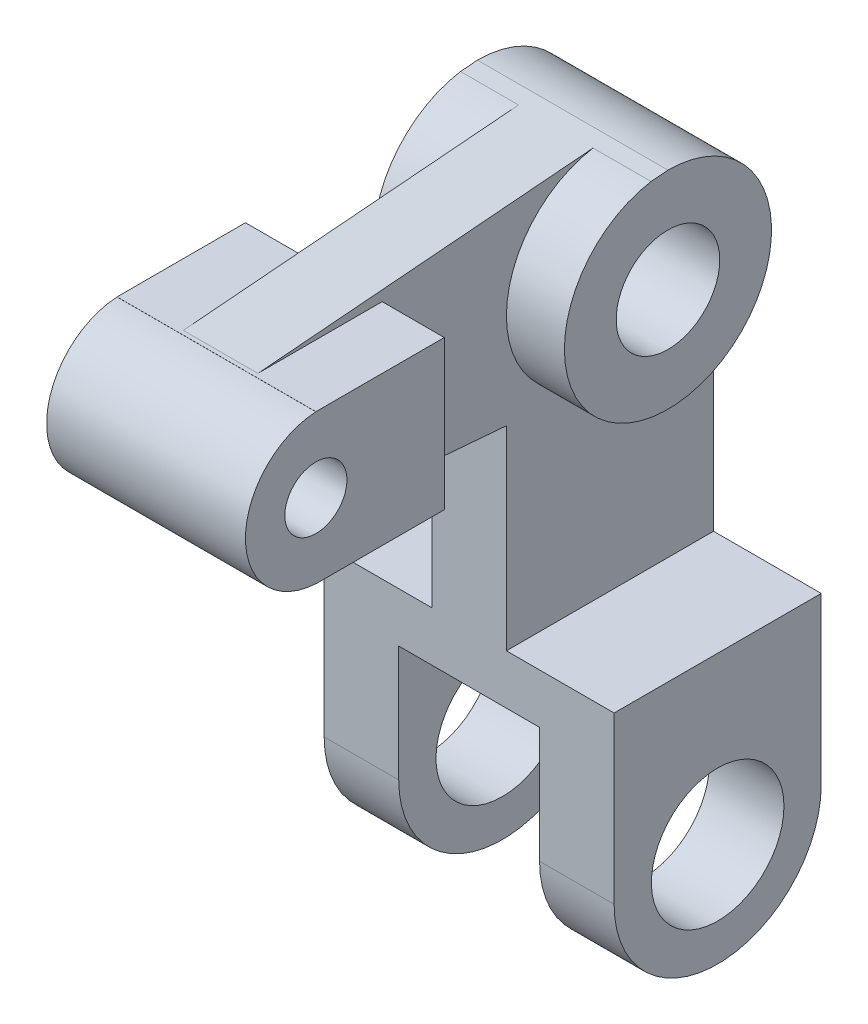
ISO-10303-21;
HEADER;
FILE_DESCRIPTION(('STEP AP214'),'2;1');
FILE_NAME('part.step','',(''),(''),'','','');
FILE_SCHEMA(('AUTOMOTIVE_DESIGN { 1 0 10303 214 1 1 1 1 }'));
ENDSEC;
DATA;
#1=APPLICATION_CONTEXT('core data for automotive mechanical design processes');
#2=APPLICATION_PROTOCOL_DEFINITION('international standard','automotive_design',2000,#1);
#3=PRODUCT_CONTEXT('',#1,'mechanical');
#4=PRODUCT('Part','Part','',(#3));
#5=PRODUCT_RELATED_PRODUCT_CATEGORY('part','',(#4));
#6=PRODUCT_DEFINITION_FORMATION('','',#4);
#7=PRODUCT_DEFINITION_CONTEXT('part definition',#1,'design');
#8=PRODUCT_DEFINITION('design','',#6,#7);
#9=PRODUCT_DEFINITION_SHAPE('','',#8);
#10=(LENGTH_UNIT() NAMED_UNIT(*) SI_UNIT(.MILLI.,.METRE.));
#11=(NAMED_UNIT(*) PLANE_ANGLE_UNIT() SI_UNIT($,.RADIAN.));
#12=(NAMED_UNIT(*) SI_UNIT($,.STERADIAN.) SOLID_ANGLE_UNIT());
#13=UNCERTAINTY_MEASURE_WITH_UNIT(LENGTH_MEASURE(1.E-05),#10,'distance_accuracy_value','');
#14=(GEOMETRIC_REPRESENTATION_CONTEXT(3) GLOBAL_UNCERTAINTY_ASSIGNED_CONTEXT((#13)) GLOBAL_UNIT_ASSIGNED_CONTEXT((#10,
#11,#12)) REPRESENTATION_CONTEXT('',''));
#15=CARTESIAN_POINT('',(0.,0.,0.));
#16=DIRECTION('',(0.,0.,1.));
#17=DIRECTION('',(1.,0.,0.));
#18=AXIS2_PLACEMENT_3D('',#15,#16,#17);
#19=CARTESIAN_POINT('',(9.,0.,0.));
#20=DIRECTION('',(1.,0.,0.));
#21=DIRECTION('',(0.,0.,-1.));
#22=AXIS2_PLACEMENT_3D('',#19,#20,#21);
#23=PLANE('',#22);
#24=DIRECTION('',(0.,-1.,0.));
#25=VECTOR('',#24,1.);
#26=CARTESIAN_POINT('',(9.,0.,55.));
#27=LINE('',#26,#25);
#28=CARTESIAN_POINT('',(9.,128.,55.));
#29=VERTEX_POINT('',#28);
#30=CARTESIAN_POINT('',(9.,92.,55.));
#31=VERTEX_POINT('',#30);
#32=EDGE_CURVE('E65',#29,#31,#27,.T.);
#33=ORIENTED_EDGE('',*,*,#32,.T.);
#34=DIRECTION('',(0.,0.,1.));
#35=VECTOR('',#34,1.);
#36=CARTESIAN_POINT('',(9.,92.,0.));
#37=LINE('',#36,#35);
#38=CARTESIAN_POINT('',(9.,92.,84.9999999999999));
#39=VERTEX_POINT('',#38);
#40=EDGE_CURVE('E274',#31,#39,#37,.T.);
#41=ORIENTED_EDGE('',*,*,#40,.T.);
#42=DIRECTION('',(0.,-0.0820750945403038,-0.996626147989405));
#43=VECTOR('',#42,1.);
#44=CARTESIAN_POINT('',(9.,84.427412702777,-6.95284575199339));
#45=LINE('',#44,#43);
#46=CARTESIAN_POINT('',(9.,87.0588235294118,25.));
#47=VERTEX_POINT('',#46);
#48=EDGE_CURVE('E405',#39,#47,#45,.T.);
#49=ORIENTED_EDGE('',*,*,#48,.T.);
#50=DIRECTION('',(0.,1.,0.));
#51=VECTOR('',#50,1.);
#52=CARTESIAN_POINT('',(9.,0.,25.));
#53=LINE('',#52,#51);
#54=CARTESIAN_POINT('',(9.,40.,25.));
#55=VERTEX_POINT('',#54);
#56=EDGE_CURVE('E408',#55,#47,#53,.T.);
#57=ORIENTED_EDGE('',*,*,#56,.F.);
#58=DIRECTION('',(0.,0.,-1.));
#59=VECTOR('',#58,1.);
#60=CARTESIAN_POINT('',(9.,40.,0.));
#61=LINE('',#60,#59);
#62=CARTESIAN_POINT('',(9.,40.,-25.));
#63=VERTEX_POINT('',#62);
#64=EDGE_CURVE('E413',#55,#63,#61,.T.);
#65=ORIENTED_EDGE('',*,*,#64,.T.);
#66=DIRECTION('',(0.,-1.,0.));
#67=VECTOR('',#66,1.);
#68=CARTESIAN_POINT('',(9.,0.,-25.));
#69=LINE('',#68,#67);
#70=CARTESIAN_POINT('',(9.,110.,-25.));
#71=VERTEX_POINT('',#70);
#72=EDGE_CURVE('E417',#71,#63,#69,.T.);
#73=ORIENTED_EDGE('',*,*,#72,.F.);
#74=CARTESIAN_POINT('',(9.,110.,0.));
#75=DIRECTION('',(1.,0.,0.));
#76=DIRECTION('',(0.,0.,-1.));
#77=AXIS2_PLACEMENT_3D('',#74,#75,#76);
#78=CIRCLE('',#77,25.);
#79=CARTESIAN_POINT('',(9.,134.66318394281,4.08990926587834));
#80=VERTEX_POINT('',#79);
#81=EDGE_CURVE('E421',#80,#71,#78,.T.);
#82=ORIENTED_EDGE('',*,*,#81,.F.);
#83=DIRECTION('',(0.,0.082075094540304,-0.996626147989405));
#84=VECTOR('',#83,1.);
#85=CARTESIAN_POINT('',(9.,134.090596645587,11.0427550178719));
#86=LINE('',#85,#84);
#87=CARTESIAN_POINT('',(9.,128.,84.9999999999999));
#88=VERTEX_POINT('',#87);
#89=EDGE_CURVE('E424',#88,#80,#86,.T.);
#90=ORIENTED_EDGE('',*,*,#89,.F.);
#91=DIRECTION('',(0.,0.,-1.));
#92=VECTOR('',#91,1.);
#93=CARTESIAN_POINT('',(9.,128.,0.));
#94=LINE('',#93,#92);
#95=EDGE_CURVE('E271',#88,#29,#94,.T.);
#96=ORIENTED_EDGE('',*,*,#95,.T.);
#97=EDGE_LOOP('',(#33,#41,#49,#57,#65,#73,#82,#90,#96));
#98=FACE_BOUND('',#97,.T.);
#99=ADVANCED_FACE('F40',(#98),#23,.T.);
#100=CARTESIAN_POINT('',(-9.,0.,0.));
#101=DIRECTION('',(1.,0.,0.));
#102=DIRECTION('',(0.,0.,-1.));
#103=AXIS2_PLACEMENT_3D('',#100,#101,#102);
#104=PLANE('',#103);
#105=DIRECTION('',(0.,0.,1.));
#106=VECTOR('',#105,1.);
#107=CARTESIAN_POINT('',(-9.,92.,0.));
#108=LINE('',#107,#106);
#109=CARTESIAN_POINT('',(-9.,92.,55.));
#110=VERTEX_POINT('',#109);
#111=CARTESIAN_POINT('',(-9.,92.,85.));
#112=VERTEX_POINT('',#111);
#113=EDGE_CURVE('E11',#110,#112,#108,.T.);
#114=ORIENTED_EDGE('',*,*,#113,.F.);
#115=DIRECTION('',(0.,-1.,0.));
#116=VECTOR('',#115,1.);
#117=CARTESIAN_POINT('',(-9.,0.,55.));
#118=LINE('',#117,#116);
#119=CARTESIAN_POINT('',(-9.,128.,55.));
#120=VERTEX_POINT('',#119);
#121=EDGE_CURVE('E478',#120,#110,#118,.T.);
#122=ORIENTED_EDGE('',*,*,#121,.F.);
#123=DIRECTION('',(0.,0.,-1.));
#124=VECTOR('',#123,1.);
#125=CARTESIAN_POINT('',(-9.,128.,0.));
#126=LINE('',#125,#124);
#127=CARTESIAN_POINT('',(-9.,128.,85.));
#128=VERTEX_POINT('',#127);
#129=EDGE_CURVE('E50',#128,#120,#126,.T.);
#130=ORIENTED_EDGE('',*,*,#129,.F.);
#131=DIRECTION('',(0.,0.082075094540304,-0.996626147989405));
#132=VECTOR('',#131,1.);
#133=CARTESIAN_POINT('',(-9.,134.090596645587,11.0427550178719));
#134=LINE('',#133,#132);
#135=CARTESIAN_POINT('',(-9.,134.66318394281,4.08990926587834));
#136=VERTEX_POINT('',#135);
#137=EDGE_CURVE('E409',#128,#136,#134,.T.);
#138=ORIENTED_EDGE('',*,*,#137,.T.);
#139=CARTESIAN_POINT('',(-9.,110.,0.));
#140=DIRECTION('',(1.,0.,0.));
#141=DIRECTION('',(0.,0.,-1.));
#142=AXIS2_PLACEMENT_3D('',#139,#140,#141);
#143=CIRCLE('',#142,25.);
#144=CARTESIAN_POINT('',(-9.,110.,-25.));
#145=VERTEX_POINT('',#144);
#146=EDGE_CURVE('E443',#136,#145,#143,.T.);
#147=ORIENTED_EDGE('',*,*,#146,.T.);
#148=DIRECTION('',(0.,-1.,0.));
#149=VECTOR('',#148,1.);
#150=CARTESIAN_POINT('',(-9.,0.,-25.));
#151=LINE('',#150,#149);
#152=CARTESIAN_POINT('',(-9.,40.,-25.));
#153=VERTEX_POINT('',#152);
#154=EDGE_CURVE('E439',#145,#153,#151,.T.);
#155=ORIENTED_EDGE('',*,*,#154,.T.);
#156=DIRECTION('',(0.,0.,-1.));
#157=VECTOR('',#156,1.);
#158=CARTESIAN_POINT('',(-9.,40.,0.));
#159=LINE('',#158,#157);
#160=CARTESIAN_POINT('',(-9.,40.,25.));
#161=VERTEX_POINT('',#160);
#162=EDGE_CURVE('E436',#161,#153,#159,.T.);
#163=ORIENTED_EDGE('',*,*,#162,.F.);
#164=DIRECTION('',(0.,1.,0.));
#165=VECTOR('',#164,1.);
#166=CARTESIAN_POINT('',(-9.,0.,25.));
#167=LINE('',#166,#165);
#168=CARTESIAN_POINT('',(-9.,87.0588235294118,25.));
#169=VERTEX_POINT('',#168);
#170=EDGE_CURVE('E432',#161,#169,#167,.T.);
#171=ORIENTED_EDGE('',*,*,#170,.T.);
#172=DIRECTION('',(0.,-0.0820750945403038,-0.996626147989405));
#173=VECTOR('',#172,1.);
#174=CARTESIAN_POINT('',(-9.,84.427412702777,-6.95284575199339));
#175=LINE('',#174,#173);
#176=EDGE_CURVE('E404',#112,#169,#175,.T.);
#177=ORIENTED_EDGE('',*,*,#176,.F.);
#178=EDGE_LOOP('',(#114,#122,#130,#138,#147,#155,#163,#171,#177));
#179=FACE_BOUND('',#178,.T.);
#180=ADVANCED_FACE('F530',(#179),#104,.F.);
#181=CARTESIAN_POINT('',(35.,0.,0.));
#182=DIRECTION('',(-1.,0.,0.));
#183=DIRECTION('',(0.,0.,1.));
#184=AXIS2_PLACEMENT_3D('',#181,#182,#183);
#185=CYLINDRICAL_SURFACE('',#184,25.);
#186=DIRECTION('',(-1.,0.,0.));
#187=VECTOR('',#186,1.);
#188=CARTESIAN_POINT('',(35.,0.,-25.));
#189=LINE('',#188,#187);
#190=CARTESIAN_POINT('',(-17.,0.,-25.));
#191=VERTEX_POINT('',#190);
#192=CARTESIAN_POINT('',(-35.,0.,-25.));
#193=VERTEX_POINT('',#192);
#194=EDGE_CURVE('E364',#191,#193,#189,.T.);
#195=ORIENTED_EDGE('',*,*,#194,.F.);
#196=CARTESIAN_POINT('',(-17.,0.,0.));
#197=DIRECTION('',(-1.,0.,0.));
#198=DIRECTION('',(0.,-1.,0.));
#199=AXIS2_PLACEMENT_3D('',#196,#197,#198);
#200=CIRCLE('',#199,25.);
#201=CARTESIAN_POINT('',(-17.,0.,25.));
#202=VERTEX_POINT('',#201);
#203=EDGE_CURVE('E303',#191,#202,#200,.T.);
#204=ORIENTED_EDGE('',*,*,#203,.T.);
#205=DIRECTION('',(-1.,0.,0.));
#206=VECTOR('',#205,1.);
#207=CARTESIAN_POINT('',(35.,0.,25.));
#208=LINE('',#207,#206);
#209=CARTESIAN_POINT('',(-35.,0.,25.));
#210=VERTEX_POINT('',#209);
#211=EDGE_CURVE('E369',#202,#210,#208,.T.);
#212=ORIENTED_EDGE('',*,*,#211,.T.);
#213=CARTESIAN_POINT('',(-35.,0.,0.));
#214=DIRECTION('',(1.,0.,0.));
#215=DIRECTION('',(0.,0.,-1.));
#216=AXIS2_PLACEMENT_3D('',#213,#214,#215);
#217=CIRCLE('',#216,25.);
#218=EDGE_CURVE('E345',#210,#193,#217,.T.);
#219=ORIENTED_EDGE('',*,*,#218,.T.);
#220=EDGE_LOOP('',(#195,#204,#212,#219));
#221=FACE_BOUND('',#220,.T.);
#222=ADVANCED_FACE('F536',(#221),#185,.T.);
#223=CARTESIAN_POINT('',(35.,0.,0.));
#224=DIRECTION('',(-1.,0.,0.));
#225=DIRECTION('',(0.,0.,1.));
#226=AXIS2_PLACEMENT_3D('',#223,#224,#225);
#227=CYLINDRICAL_SURFACE('',#226,16.);
#228=CARTESIAN_POINT('',(-17.,0.,0.));
#229=DIRECTION('',(-1.,0.,0.));
#230=DIRECTION('',(0.,-1.,0.));
#231=AXIS2_PLACEMENT_3D('',#228,#229,#230);
#232=CIRCLE('',#231,16.);
#233=CARTESIAN_POINT('',(-17.,-16.,0.));
#234=VERTEX_POINT('',#233);
#235=EDGE_CURVE('E302',#234,#234,#232,.T.);
#236=ORIENTED_EDGE('',*,*,#235,.F.);
#237=EDGE_LOOP('',(#236));
#238=FACE_BOUND('',#237,.T.);
#239=CARTESIAN_POINT('',(-35.,0.,0.));
#240=DIRECTION('',(1.,0.,0.));
#241=DIRECTION('',(0.,0.,-1.));
#242=AXIS2_PLACEMENT_3D('',#239,#240,#241);
#243=CIRCLE('',#242,16.);
#244=CARTESIAN_POINT('',(-35.,0.,-16.));
#245=VERTEX_POINT('',#244);
#246=EDGE_CURVE('E316',#245,#245,#243,.T.);
#247=ORIENTED_EDGE('',*,*,#246,.F.);
#248=EDGE_LOOP('',(#247));
#249=FACE_BOUND('',#248,.T.);
#250=ADVANCED_FACE('F557',(#238,#249),#227,.F.);
#251=CARTESIAN_POINT('',(9.,84.427412702777,-6.95284575199339));
#252=DIRECTION('',(0.,0.996626147989405,-0.0820750945403038));
#253=DIRECTION('',(0.,0.0820750945403038,0.996626147989405));
#254=AXIS2_PLACEMENT_3D('',#251,#252,#253);
#255=PLANE('',#254);
#256=ORIENTED_EDGE('',*,*,#176,.T.);
#257=DIRECTION('',(-1.,0.,0.));
#258=VECTOR('',#257,1.);
#259=CARTESIAN_POINT('',(9.,87.0588235294118,25.));
#260=LINE('',#259,#258);
#261=EDGE_CURVE('E456',#47,#169,#260,.T.);
#262=ORIENTED_EDGE('',*,*,#261,.F.);
#263=ORIENTED_EDGE('',*,*,#48,.F.);
#264=DIRECTION('',(-1.,0.,0.));
#265=VECTOR('',#264,1.);
#266=CARTESIAN_POINT('',(9.,92.,85.));
#267=LINE('',#266,#265);
#268=EDGE_CURVE('E459',#39,#112,#267,.T.);
#269=ORIENTED_EDGE('',*,*,#268,.T.);
#270=EDGE_LOOP('',(#256,#262,#263,#269));
#271=FACE_BOUND('',#270,.T.);
#272=ADVANCED_FACE('F554',(#271),#255,.F.);
#273=CARTESIAN_POINT('',(9.,0.,25.));
#274=DIRECTION('',(0.,0.,1.));
#275=DIRECTION('',(1.,0.,0.));
#276=AXIS2_PLACEMENT_3D('',#273,#274,#275);
#277=PLANE('',#276);
#278=DIRECTION('',(0.,-1.,0.));
#279=VECTOR('',#278,1.);
#280=CARTESIAN_POINT('',(-17.,0.,25.));
#281=LINE('',#280,#279);
#282=CARTESIAN_POINT('',(-17.,28.,25.));
#283=VERTEX_POINT('',#282);
#284=EDGE_CURVE('E310',#283,#202,#281,.T.);
#285=ORIENTED_EDGE('',*,*,#284,.F.);
#286=DIRECTION('',(-1.,0.,0.));
#287=VECTOR('',#286,1.);
#288=CARTESIAN_POINT('',(9.,28.,25.));
#289=LINE('',#288,#287);
#290=CARTESIAN_POINT('',(17.,28.,25.));
#291=VERTEX_POINT('',#290);
#292=EDGE_CURVE('E313',#291,#283,#289,.T.);
#293=ORIENTED_EDGE('',*,*,#292,.F.);
#294=DIRECTION('',(0.,1.,0.));
#295=VECTOR('',#294,1.);
#296=CARTESIAN_POINT('',(17.,0.,25.));
#297=LINE('',#296,#295);
#298=CARTESIAN_POINT('',(17.,0.,25.));
#299=VERTEX_POINT('',#298);
#300=EDGE_CURVE('E299',#299,#291,#297,.T.);
#301=ORIENTED_EDGE('',*,*,#300,.F.);
#302=CARTESIAN_POINT('',(35.,0.,25.));
#303=VERTEX_POINT('',#302);
#304=EDGE_CURVE('E370',#303,#299,#208,.T.);
#305=ORIENTED_EDGE('',*,*,#304,.F.);
#306=DIRECTION('',(0.,1.,0.));
#307=VECTOR('',#306,1.);
#308=CARTESIAN_POINT('',(35.,0.,25.));
#309=LINE('',#308,#307);
#310=CARTESIAN_POINT('',(35.,40.,25.));
#311=VERTEX_POINT('',#310);
#312=EDGE_CURVE('E321',#303,#311,#309,.T.);
#313=ORIENTED_EDGE('',*,*,#312,.T.);
#314=DIRECTION('',(-1.,0.,0.));
#315=VECTOR('',#314,1.);
#316=CARTESIAN_POINT('',(35.,40.,25.));
#317=LINE('',#316,#315);
#318=EDGE_CURVE('E356',#311,#55,#317,.T.);
#319=ORIENTED_EDGE('',*,*,#318,.T.);
#320=ORIENTED_EDGE('',*,*,#56,.T.);
#321=ORIENTED_EDGE('',*,*,#261,.T.);
#322=ORIENTED_EDGE('',*,*,#170,.F.);
#323=CARTESIAN_POINT('',(-35.,40.,25.));
#324=VERTEX_POINT('',#323);
#325=EDGE_CURVE('E337',#161,#324,#317,.T.);
#326=ORIENTED_EDGE('',*,*,#325,.T.);
#327=DIRECTION('',(0.,1.,0.));
#328=VECTOR('',#327,1.);
#329=CARTESIAN_POINT('',(-35.,0.,25.));
#330=LINE('',#329,#328);
#331=EDGE_CURVE('E341',#210,#324,#330,.T.);
#332=ORIENTED_EDGE('',*,*,#331,.F.);
#333=ORIENTED_EDGE('',*,*,#211,.F.);
#334=EDGE_LOOP('',(#285,#293,#301,#305,#313,#319,#320,#321,#322,#326,#332,#333));
#335=FACE_BOUND('',#334,.T.);
#336=ADVANCED_FACE('F550',(#335),#277,.T.);
#337=CARTESIAN_POINT('',(9.,0.,-25.));
#338=DIRECTION('',(0.,0.,-1.));
#339=DIRECTION('',(0.,1.,0.));
#340=AXIS2_PLACEMENT_3D('',#337,#338,#339);
#341=PLANE('',#340);
#342=DIRECTION('',(0.,1.,0.));
#343=VECTOR('',#342,1.);
#344=CARTESIAN_POINT('',(-17.,0.,-25.));
#345=LINE('',#344,#343);
#346=CARTESIAN_POINT('',(-17.,28.,-25.));
#347=VERTEX_POINT('',#346);
#348=EDGE_CURVE('E307',#191,#347,#345,.T.);
#349=ORIENTED_EDGE('',*,*,#348,.F.);
#350=ORIENTED_EDGE('',*,*,#194,.T.);
#351=DIRECTION('',(0.,-1.,0.));
#352=VECTOR('',#351,1.);
#353=CARTESIAN_POINT('',(-35.,0.,-25.));
#354=LINE('',#353,#352);
#355=CARTESIAN_POINT('',(-35.,40.,-25.));
#356=VERTEX_POINT('',#355);
#357=EDGE_CURVE('E349',#356,#193,#354,.T.);
#358=ORIENTED_EDGE('',*,*,#357,.F.);
#359=DIRECTION('',(-1.,0.,0.));
#360=VECTOR('',#359,1.);
#361=CARTESIAN_POINT('',(35.,40.,-25.));
#362=LINE('',#361,#360);
#363=EDGE_CURVE('E360',#153,#356,#362,.T.);
#364=ORIENTED_EDGE('',*,*,#363,.F.);
#365=ORIENTED_EDGE('',*,*,#154,.F.);
#366=DIRECTION('',(-1.,0.,0.));
#367=VECTOR('',#366,1.);
#368=CARTESIAN_POINT('',(9.,110.,-25.));
#369=LINE('',#368,#367);
#370=EDGE_CURVE('E453',#71,#145,#369,.T.);
#371=ORIENTED_EDGE('',*,*,#370,.F.);
#372=ORIENTED_EDGE('',*,*,#72,.T.);
#373=CARTESIAN_POINT('',(35.,40.,-25.));
#374=VERTEX_POINT('',#373);
#375=EDGE_CURVE('E361',#374,#63,#362,.T.);
#376=ORIENTED_EDGE('',*,*,#375,.F.);
#377=DIRECTION('',(0.,-1.,0.));
#378=VECTOR('',#377,1.);
#379=CARTESIAN_POINT('',(35.,0.,-25.));
#380=LINE('',#379,#378);
#381=CARTESIAN_POINT('',(35.,0.,-25.));
#382=VERTEX_POINT('',#381);
#383=EDGE_CURVE('E329',#374,#382,#380,.T.);
#384=ORIENTED_EDGE('',*,*,#383,.T.);
#385=CARTESIAN_POINT('',(17.,0.,-25.));
#386=VERTEX_POINT('',#385);
#387=EDGE_CURVE('E365',#382,#386,#189,.T.);
#388=ORIENTED_EDGE('',*,*,#387,.T.);
#389=DIRECTION('',(0.,-1.,0.));
#390=VECTOR('',#389,1.);
#391=CARTESIAN_POINT('',(17.,0.,-25.));
#392=LINE('',#391,#390);
#393=CARTESIAN_POINT('',(17.,28.,-25.));
#394=VERTEX_POINT('',#393);
#395=EDGE_CURVE('E296',#394,#386,#392,.T.);
#396=ORIENTED_EDGE('',*,*,#395,.F.);
#397=DIRECTION('',(1.,0.,0.));
#398=VECTOR('',#397,1.);
#399=CARTESIAN_POINT('',(9.,28.,-25.));
#400=LINE('',#399,#398);
#401=EDGE_CURVE('E467',#347,#394,#400,.T.);
#402=ORIENTED_EDGE('',*,*,#401,.F.);
#403=EDGE_LOOP('',(#349,#350,#358,#364,#365,#371,#372,#376,#384,#388,#396,#402));
#404=FACE_BOUND('',#403,.T.);
#405=ADVANCED_FACE('F546',(#404),#341,.T.);
#406=CARTESIAN_POINT('',(9.,134.090596645587,11.0427550178719));
#407=DIRECTION('',(0.,0.996626147989405,0.082075094540304));
#408=DIRECTION('',(0.,-0.082075094540304,0.996626147989405));
#409=AXIS2_PLACEMENT_3D('',#406,#407,#408);
#410=PLANE('',#409);
#411=ORIENTED_EDGE('',*,*,#137,.F.);
#412=DIRECTION('',(-1.,0.,0.));
#413=VECTOR('',#412,1.);
#414=CARTESIAN_POINT('',(9.,128.,85.));
#415=LINE('',#414,#413);
#416=EDGE_CURVE('E428',#88,#128,#415,.T.);
#417=ORIENTED_EDGE('',*,*,#416,.F.);
#418=ORIENTED_EDGE('',*,*,#89,.T.);
#419=DIRECTION('',(-1.,0.,0.));
#420=VECTOR('',#419,1.);
#421=CARTESIAN_POINT('',(23.,134.66318394281,4.08990926587834));
#422=LINE('',#421,#420);
#423=CARTESIAN_POINT('',(23.,134.66318394281,4.08990926587834));
#424=VERTEX_POINT('',#423);
#425=EDGE_CURVE('E398',#424,#80,#422,.T.);
#426=ORIENTED_EDGE('',*,*,#425,.F.);
#427=DIRECTION('',(0.,0.082075094540304,-0.996626147989405));
#428=VECTOR('',#427,1.);
#429=CARTESIAN_POINT('',(23.,134.090596645587,11.0427550178719));
#430=LINE('',#429,#428);
#431=CARTESIAN_POINT('',(23.,135.,0.));
#432=VERTEX_POINT('',#431);
#433=EDGE_CURVE('E383',#424,#432,#430,.T.);
#434=ORIENTED_EDGE('',*,*,#433,.T.);
#435=DIRECTION('',(-1.,0.,0.));
#436=VECTOR('',#435,1.);
#437=CARTESIAN_POINT('',(23.,135.,0.));
#438=LINE('',#437,#436);
#439=CARTESIAN_POINT('',(-23.,135.,0.));
#440=VERTEX_POINT('',#439);
#441=EDGE_CURVE('E401',#432,#440,#438,.T.);
#442=ORIENTED_EDGE('',*,*,#441,.T.);
#443=DIRECTION('',(0.,0.082075094540304,-0.996626147989405));
#444=VECTOR('',#443,1.);
#445=CARTESIAN_POINT('',(-23.,134.090596645587,11.0427550178719));
#446=LINE('',#445,#444);
#447=CARTESIAN_POINT('',(-23.,134.66318394281,4.08990926587834));
#448=VERTEX_POINT('',#447);
#449=EDGE_CURVE('E380',#448,#440,#446,.T.);
#450=ORIENTED_EDGE('',*,*,#449,.F.);
#451=EDGE_CURVE('E387',#136,#448,#422,.T.);
#452=ORIENTED_EDGE('',*,*,#451,.F.);
#453=EDGE_LOOP('',(#411,#417,#418,#426,#434,#442,#450,#452));
#454=FACE_BOUND('',#453,.T.);
#455=ADVANCED_FACE('F542',(#454),#410,.T.);
#456=CARTESIAN_POINT('',(23.,110.,0.));
#457=DIRECTION('',(-1.,0.,0.));
#458=DIRECTION('',(0.,0.,1.));
#459=AXIS2_PLACEMENT_3D('',#456,#457,#458);
#460=CYLINDRICAL_SURFACE('',#459,25.);
#461=ORIENTED_EDGE('',*,*,#81,.T.);
#462=ORIENTED_EDGE('',*,*,#370,.T.);
#463=ORIENTED_EDGE('',*,*,#146,.F.);
#464=ORIENTED_EDGE('',*,*,#451,.T.);
#465=CARTESIAN_POINT('',(-23.,110.,0.));
#466=DIRECTION('',(1.,0.,0.));
#467=DIRECTION('',(0.,0.,-1.));
#468=AXIS2_PLACEMENT_3D('',#465,#466,#467);
#469=CIRCLE('',#468,25.);
#470=EDGE_CURVE('E391',#448,#440,#469,.T.);
#471=ORIENTED_EDGE('',*,*,#470,.T.);
#472=ORIENTED_EDGE('',*,*,#441,.F.);
#473=CARTESIAN_POINT('',(23.,110.,0.));
#474=DIRECTION('',(1.,0.,0.));
#475=DIRECTION('',(0.,0.,-1.));
#476=AXIS2_PLACEMENT_3D('',#473,#474,#475);
#477=CIRCLE('',#476,25.);
#478=EDGE_CURVE('E379',#424,#432,#477,.T.);
#479=ORIENTED_EDGE('',*,*,#478,.F.);
#480=ORIENTED_EDGE('',*,*,#425,.T.);
#481=EDGE_LOOP('',(#461,#462,#463,#464,#471,#472,#479,#480));
#482=FACE_BOUND('',#481,.T.);
#483=ADVANCED_FACE('F545',(#482),#460,.T.);
#484=CARTESIAN_POINT('',(23.,110.,0.));
#485=DIRECTION('',(-1.,0.,0.));
#486=DIRECTION('',(0.,0.,1.));
#487=AXIS2_PLACEMENT_3D('',#484,#485,#486);
#488=CYLINDRICAL_SURFACE('',#487,12.5);
#489=CARTESIAN_POINT('',(23.,110.,0.));
#490=DIRECTION('',(1.,0.,0.));
#491=DIRECTION('',(0.,0.,-1.));
#492=AXIS2_PLACEMENT_3D('',#489,#490,#491);
#493=CIRCLE('',#492,12.5);
#494=CARTESIAN_POINT('',(23.,110.,-12.5));
#495=VERTEX_POINT('',#494);
#496=EDGE_CURVE('E375',#495,#495,#493,.T.);
#497=ORIENTED_EDGE('',*,*,#496,.T.);
#498=EDGE_LOOP('',(#497));
#499=FACE_BOUND('',#498,.T.);
#500=CARTESIAN_POINT('',(-23.,110.,0.));
#501=DIRECTION('',(1.,0.,0.));
#502=DIRECTION('',(0.,0.,-1.));
#503=AXIS2_PLACEMENT_3D('',#500,#501,#502);
#504=CIRCLE('',#503,12.5);
#505=CARTESIAN_POINT('',(-23.,110.,-12.5));
#506=VERTEX_POINT('',#505);
#507=EDGE_CURVE('E374',#506,#506,#504,.T.);
#508=ORIENTED_EDGE('',*,*,#507,.F.);
#509=EDGE_LOOP('',(#508));
#510=FACE_BOUND('',#509,.T.);
#511=ADVANCED_FACE('F539',(#499,#510),#488,.F.);
#512=CARTESIAN_POINT('',(23.,0.,0.));
#513=DIRECTION('',(1.,0.,0.));
#514=DIRECTION('',(0.,0.,-1.));
#515=AXIS2_PLACEMENT_3D('',#512,#513,#514);
#516=PLANE('',#515);
#517=ORIENTED_EDGE('',*,*,#496,.F.);
#518=EDGE_LOOP('',(#517));
#519=FACE_BOUND('',#518,.T.);
#520=ORIENTED_EDGE('',*,*,#478,.T.);
#521=ORIENTED_EDGE('',*,*,#433,.F.);
#522=EDGE_LOOP('',(#520,#521));
#523=FACE_BOUND('',#522,.T.);
#524=ADVANCED_FACE('F607',(#519,#523),#516,.T.);
#525=CARTESIAN_POINT('',(-23.,0.,0.));
#526=DIRECTION('',(1.,0.,0.));
#527=DIRECTION('',(0.,0.,-1.));
#528=AXIS2_PLACEMENT_3D('',#525,#526,#527);
#529=PLANE('',#528);
#530=ORIENTED_EDGE('',*,*,#507,.T.);
#531=EDGE_LOOP('',(#530));
#532=FACE_BOUND('',#531,.T.);
#533=ORIENTED_EDGE('',*,*,#470,.F.);
#534=ORIENTED_EDGE('',*,*,#449,.T.);
#535=EDGE_LOOP('',(#533,#534));
#536=FACE_BOUND('',#535,.T.);
#537=ADVANCED_FACE('F610',(#532,#536),#529,.F.);
#538=CARTESIAN_POINT('',(35.,40.,0.));
#539=DIRECTION('',(0.,1.,0.));
#540=DIRECTION('',(0.,0.,1.));
#541=AXIS2_PLACEMENT_3D('',#538,#539,#540);
#542=PLANE('',#541);
#543=ORIENTED_EDGE('',*,*,#64,.F.);
#544=ORIENTED_EDGE('',*,*,#318,.F.);
#545=DIRECTION('',(0.,0.,-1.));
#546=VECTOR('',#545,1.);
#547=CARTESIAN_POINT('',(35.,40.,0.));
#548=LINE('',#547,#546);
#549=EDGE_CURVE('E333',#311,#374,#548,.T.);
#550=ORIENTED_EDGE('',*,*,#549,.T.);
#551=ORIENTED_EDGE('',*,*,#375,.T.);
#552=EDGE_LOOP('',(#543,#544,#550,#551));
#553=FACE_BOUND('',#552,.T.);
#554=ADVANCED_FACE('F599',(#553),#542,.T.);
#555=ORIENTED_EDGE('',*,*,#304,.T.);
#556=CARTESIAN_POINT('',(17.,0.,0.));
#557=DIRECTION('',(1.,0.,0.));
#558=DIRECTION('',(0.,1.,0.));
#559=AXIS2_PLACEMENT_3D('',#556,#557,#558);
#560=CIRCLE('',#559,25.);
#561=EDGE_CURVE('E292',#299,#386,#560,.T.);
#562=ORIENTED_EDGE('',*,*,#561,.T.);
#563=ORIENTED_EDGE('',*,*,#387,.F.);
#564=CARTESIAN_POINT('',(35.,0.,0.));
#565=DIRECTION('',(1.,0.,0.));
#566=DIRECTION('',(0.,0.,-1.));
#567=AXIS2_PLACEMENT_3D('',#564,#565,#566);
#568=CIRCLE('',#567,25.);
#569=EDGE_CURVE('E326',#303,#382,#568,.T.);
#570=ORIENTED_EDGE('',*,*,#569,.F.);
#571=EDGE_LOOP('',(#555,#562,#563,#570));
#572=FACE_BOUND('',#571,.T.);
#573=ADVANCED_FACE('F600',(#572),#185,.T.);
#574=CARTESIAN_POINT('',(17.,0.,0.));
#575=DIRECTION('',(1.,0.,0.));
#576=DIRECTION('',(0.,1.,0.));
#577=AXIS2_PLACEMENT_3D('',#574,#575,#576);
#578=CIRCLE('',#577,16.);
#579=CARTESIAN_POINT('',(17.,16.,0.));
#580=VERTEX_POINT('',#579);
#581=EDGE_CURVE('E288',#580,#580,#578,.T.);
#582=ORIENTED_EDGE('',*,*,#581,.F.);
#583=EDGE_LOOP('',(#582));
#584=FACE_BOUND('',#583,.T.);
#585=CARTESIAN_POINT('',(35.,0.,0.));
#586=DIRECTION('',(1.,0.,0.));
#587=DIRECTION('',(0.,0.,-1.));
#588=AXIS2_PLACEMENT_3D('',#585,#586,#587);
#589=CIRCLE('',#588,16.);
#590=CARTESIAN_POINT('',(35.,0.,-16.));
#591=VERTEX_POINT('',#590);
#592=EDGE_CURVE('E317',#591,#591,#589,.T.);
#593=ORIENTED_EDGE('',*,*,#592,.T.);
#594=EDGE_LOOP('',(#593));
#595=FACE_BOUND('',#594,.T.);
#596=ADVANCED_FACE('F597',(#584,#595),#227,.F.);
#597=ORIENTED_EDGE('',*,*,#325,.F.);
#598=ORIENTED_EDGE('',*,*,#162,.T.);
#599=ORIENTED_EDGE('',*,*,#363,.T.);
#600=DIRECTION('',(0.,0.,-1.));
#601=VECTOR('',#600,1.);
#602=CARTESIAN_POINT('',(-35.,40.,0.));
#603=LINE('',#602,#601);
#604=EDGE_CURVE('E322',#324,#356,#603,.T.);
#605=ORIENTED_EDGE('',*,*,#604,.F.);
#606=EDGE_LOOP('',(#597,#598,#599,#605));
#607=FACE_BOUND('',#606,.T.);
#608=ADVANCED_FACE('F590',(#607),#542,.T.);
#609=CARTESIAN_POINT('',(35.,0.,0.));
#610=DIRECTION('',(1.,0.,0.));
#611=DIRECTION('',(0.,0.,-1.));
#612=AXIS2_PLACEMENT_3D('',#609,#610,#611);
#613=PLANE('',#612);
#614=ORIENTED_EDGE('',*,*,#592,.F.);
#615=EDGE_LOOP('',(#614));
#616=FACE_BOUND('',#615,.T.);
#617=ORIENTED_EDGE('',*,*,#312,.F.);
#618=ORIENTED_EDGE('',*,*,#569,.T.);
#619=ORIENTED_EDGE('',*,*,#383,.F.);
#620=ORIENTED_EDGE('',*,*,#549,.F.);
#621=EDGE_LOOP('',(#617,#618,#619,#620));
#622=FACE_BOUND('',#621,.T.);
#623=ADVANCED_FACE('F587',(#616,#622),#613,.T.);
#624=CARTESIAN_POINT('',(-35.,0.,0.));
#625=DIRECTION('',(1.,0.,0.));
#626=DIRECTION('',(0.,0.,-1.));
#627=AXIS2_PLACEMENT_3D('',#624,#625,#626);
#628=PLANE('',#627);
#629=ORIENTED_EDGE('',*,*,#246,.T.);
#630=EDGE_LOOP('',(#629));
#631=FACE_BOUND('',#630,.T.);
#632=ORIENTED_EDGE('',*,*,#331,.T.);
#633=ORIENTED_EDGE('',*,*,#604,.T.);
#634=ORIENTED_EDGE('',*,*,#357,.T.);
#635=ORIENTED_EDGE('',*,*,#218,.F.);
#636=EDGE_LOOP('',(#632,#633,#634,#635));
#637=FACE_BOUND('',#636,.T.);
#638=ADVANCED_FACE('F585',(#631,#637),#628,.F.);
#639=CARTESIAN_POINT('',(-17.,28.,-70.));
#640=DIRECTION('',(-1.,0.,0.));
#641=DIRECTION('',(0.,-1.,0.));
#642=AXIS2_PLACEMENT_3D('',#639,#640,#641);
#643=PLANE('',#642);
#644=ORIENTED_EDGE('',*,*,#284,.T.);
#645=ORIENTED_EDGE('',*,*,#203,.F.);
#646=ORIENTED_EDGE('',*,*,#348,.T.);
#647=DIRECTION('',(0.,0.,1.));
#648=VECTOR('',#647,1.);
#649=CARTESIAN_POINT('',(-17.,28.,-70.));
#650=LINE('',#649,#648);
#651=EDGE_CURVE('E284',#347,#283,#650,.T.);
#652=ORIENTED_EDGE('',*,*,#651,.T.);
#653=EDGE_LOOP('',(#644,#645,#646,#652));
#654=FACE_BOUND('',#653,.T.);
#655=ORIENTED_EDGE('',*,*,#235,.T.);
#656=EDGE_LOOP('',(#655));
#657=FACE_BOUND('',#656,.T.);
#658=ADVANCED_FACE('F578',(#654,#657),#643,.F.);
#659=CARTESIAN_POINT('',(-17.,28.,-70.));
#660=DIRECTION('',(0.,1.,0.));
#661=DIRECTION('',(-1.,0.,0.));
#662=AXIS2_PLACEMENT_3D('',#659,#660,#661);
#663=PLANE('',#662);
#664=ORIENTED_EDGE('',*,*,#292,.T.);
#665=ORIENTED_EDGE('',*,*,#651,.F.);
#666=ORIENTED_EDGE('',*,*,#401,.T.);
#667=DIRECTION('',(0.,0.,1.));
#668=VECTOR('',#667,1.);
#669=CARTESIAN_POINT('',(17.,28.,-70.));
#670=LINE('',#669,#668);
#671=EDGE_CURVE('E283',#394,#291,#670,.T.);
#672=ORIENTED_EDGE('',*,*,#671,.T.);
#673=EDGE_LOOP('',(#664,#665,#666,#672));
#674=FACE_BOUND('',#673,.T.);
#675=ADVANCED_FACE('F574',(#674),#663,.F.);
#676=CARTESIAN_POINT('',(17.,28.,-70.));
#677=DIRECTION('',(1.,0.,0.));
#678=DIRECTION('',(0.,1.,0.));
#679=AXIS2_PLACEMENT_3D('',#676,#677,#678);
#680=PLANE('',#679);
#681=ORIENTED_EDGE('',*,*,#300,.T.);
#682=ORIENTED_EDGE('',*,*,#671,.F.);
#683=ORIENTED_EDGE('',*,*,#395,.T.);
#684=ORIENTED_EDGE('',*,*,#561,.F.);
#685=EDGE_LOOP('',(#681,#682,#683,#684));
#686=FACE_BOUND('',#685,.T.);
#687=ORIENTED_EDGE('',*,*,#581,.T.);
#688=EDGE_LOOP('',(#687));
#689=FACE_BOUND('',#688,.T.);
#690=ADVANCED_FACE('F577',(#686,#689),#680,.F.);
#691=CARTESIAN_POINT('',(0.,0.,55.));
#692=DIRECTION('',(0.,0.,1.));
#693=DIRECTION('',(1.,0.,0.));
#694=AXIS2_PLACEMENT_3D('',#691,#692,#693);
#695=PLANE('',#694);
#696=DIRECTION('',(-1.,0.,0.));
#697=VECTOR('',#696,1.);
#698=CARTESIAN_POINT('',(-24.,128.,55.));
#699=LINE('',#698,#697);
#700=CARTESIAN_POINT('',(-24.,128.,55.));
#701=VERTEX_POINT('',#700);
#702=EDGE_CURVE('E258',#120,#701,#699,.T.);
#703=ORIENTED_EDGE('',*,*,#702,.F.);
#704=ORIENTED_EDGE('',*,*,#121,.T.);
#705=DIRECTION('',(1.,0.,0.));
#706=VECTOR('',#705,1.);
#707=CARTESIAN_POINT('',(-24.,92.,55.));
#708=LINE('',#707,#706);
#709=CARTESIAN_POINT('',(-24.,92.,55.));
#710=VERTEX_POINT('',#709);
#711=EDGE_CURVE('E251',#710,#110,#708,.T.);
#712=ORIENTED_EDGE('',*,*,#711,.F.);
#713=DIRECTION('',(0.,-1.,0.));
#714=VECTOR('',#713,1.);
#715=CARTESIAN_POINT('',(-24.,128.,55.));
#716=LINE('',#715,#714);
#717=EDGE_CURVE('E217',#701,#710,#716,.T.);
#718=ORIENTED_EDGE('',*,*,#717,.F.);
#719=EDGE_LOOP('',(#703,#704,#712,#718));
#720=FACE_BOUND('',#719,.T.);
#721=ADVANCED_FACE('F493',(#720),#695,.F.);
#722=ORIENTED_EDGE('',*,*,#32,.F.);
#723=CARTESIAN_POINT('',(24.,128.,55.));
#724=VERTEX_POINT('',#723);
#725=EDGE_CURVE('E230',#724,#29,#699,.T.);
#726=ORIENTED_EDGE('',*,*,#725,.F.);
#727=DIRECTION('',(0.,1.,0.));
#728=VECTOR('',#727,1.);
#729=CARTESIAN_POINT('',(24.,128.,55.));
#730=LINE('',#729,#728);
#731=CARTESIAN_POINT('',(24.,92.,55.));
#732=VERTEX_POINT('',#731);
#733=EDGE_CURVE('E254',#732,#724,#730,.T.);
#734=ORIENTED_EDGE('',*,*,#733,.F.);
#735=EDGE_CURVE('E249',#31,#732,#708,.T.);
#736=ORIENTED_EDGE('',*,*,#735,.F.);
#737=EDGE_LOOP('',(#722,#726,#734,#736));
#738=FACE_BOUND('',#737,.T.);
#739=ADVANCED_FACE('F516',(#738),#695,.F.);
#740=CARTESIAN_POINT('',(-24.,92.,86.));
#741=DIRECTION('',(0.,1.,0.));
#742=DIRECTION('',(0.,0.,1.));
#743=AXIS2_PLACEMENT_3D('',#740,#741,#742);
#744=PLANE('',#743);
#745=DIRECTION('',(0.,0.,-1.));
#746=VECTOR('',#745,1.);
#747=CARTESIAN_POINT('',(24.,92.,86.));
#748=LINE('',#747,#746);
#749=CARTESIAN_POINT('',(24.,92.,86.));
#750=VERTEX_POINT('',#749);
#751=EDGE_CURVE('E223',#750,#732,#748,.T.);
#752=ORIENTED_EDGE('',*,*,#751,.F.);
#753=DIRECTION('',(1.,0.,0.));
#754=VECTOR('',#753,1.);
#755=CARTESIAN_POINT('',(-24.,92.,86.));
#756=LINE('',#755,#754);
#757=CARTESIAN_POINT('',(-24.,92.,86.));
#758=VERTEX_POINT('',#757);
#759=EDGE_CURVE('E226',#758,#750,#756,.T.);
#760=ORIENTED_EDGE('',*,*,#759,.F.);
#761=DIRECTION('',(0.,0.,-1.));
#762=VECTOR('',#761,1.);
#763=CARTESIAN_POINT('',(-24.,92.,86.));
#764=LINE('',#763,#762);
#765=EDGE_CURVE('E210',#758,#710,#764,.T.);
#766=ORIENTED_EDGE('',*,*,#765,.T.);
#767=ORIENTED_EDGE('',*,*,#711,.T.);
#768=ORIENTED_EDGE('',*,*,#113,.T.);
#769=ORIENTED_EDGE('',*,*,#268,.F.);
#770=ORIENTED_EDGE('',*,*,#40,.F.);
#771=ORIENTED_EDGE('',*,*,#735,.T.);
#772=EDGE_LOOP('',(#752,#760,#766,#767,#768,#769,#770,#771));
#773=FACE_BOUND('',#772,.T.);
#774=ADVANCED_FACE('F232',(#773),#744,.F.);
#775=CARTESIAN_POINT('',(-24.,128.,86.));
#776=DIRECTION('',(0.,-1.,0.));
#777=DIRECTION('',(0.,0.,-1.));
#778=AXIS2_PLACEMENT_3D('',#775,#776,#777);
#779=PLANE('',#778);
#780=DIRECTION('',(0.,0.,-1.));
#781=VECTOR('',#780,1.);
#782=CARTESIAN_POINT('',(24.,128.,86.));
#783=LINE('',#782,#781);
#784=CARTESIAN_POINT('',(24.,128.,86.));
#785=VERTEX_POINT('',#784);
#786=EDGE_CURVE('E264',#785,#724,#783,.T.);
#787=ORIENTED_EDGE('',*,*,#786,.T.);
#788=ORIENTED_EDGE('',*,*,#725,.T.);
#789=ORIENTED_EDGE('',*,*,#95,.F.);
#790=ORIENTED_EDGE('',*,*,#416,.T.);
#791=ORIENTED_EDGE('',*,*,#129,.T.);
#792=ORIENTED_EDGE('',*,*,#702,.T.);
#793=DIRECTION('',(0.,0.,-1.));
#794=VECTOR('',#793,1.);
#795=CARTESIAN_POINT('',(-24.,128.,86.));
#796=LINE('',#795,#794);
#797=CARTESIAN_POINT('',(-24.,128.,86.));
#798=VERTEX_POINT('',#797);
#799=EDGE_CURVE('E246',#798,#701,#796,.T.);
#800=ORIENTED_EDGE('',*,*,#799,.F.);
#801=DIRECTION('',(-1.,0.,0.));
#802=VECTOR('',#801,1.);
#803=CARTESIAN_POINT('',(-24.,128.,86.));
#804=LINE('',#803,#802);
#805=EDGE_CURVE('E243',#785,#798,#804,.T.);
#806=ORIENTED_EDGE('',*,*,#805,.F.);
#807=EDGE_LOOP('',(#787,#788,#789,#790,#791,#792,#800,#806));
#808=FACE_BOUND('',#807,.T.);
#809=ADVANCED_FACE('F487',(#808),#779,.F.);
#810=CARTESIAN_POINT('',(0.,0.,86.));
#811=DIRECTION('',(0.,0.,1.));
#812=DIRECTION('',(1.,0.,0.));
#813=AXIS2_PLACEMENT_3D('',#810,#811,#812);
#814=PLANE('',#813);
#815=DIRECTION('',(-1.,0.,0.));
#816=VECTOR('',#815,1.);
#817=CARTESIAN_POINT('',(24.,92.0277992443886,86.));
#818=LINE('',#817,#816);
#819=CARTESIAN_POINT('',(-24.,92.0277992443886,86.));
#820=VERTEX_POINT('',#819);
#821=CARTESIAN_POINT('',(24.,92.0277992443886,86.));
#822=VERTEX_POINT('',#821);
#823=EDGE_CURVE('E227',#820,#822,#818,.F.);
#824=ORIENTED_EDGE('',*,*,#823,.F.);
#825=DIRECTION('',(0.,-1.,0.));
#826=VECTOR('',#825,1.);
#827=CARTESIAN_POINT('',(-24.,128.,86.));
#828=LINE('',#827,#826);
#829=EDGE_CURVE('E214',#820,#758,#828,.T.);
#830=ORIENTED_EDGE('',*,*,#829,.T.);
#831=ORIENTED_EDGE('',*,*,#759,.T.);
#832=DIRECTION('',(0.,1.,0.));
#833=VECTOR('',#832,1.);
#834=CARTESIAN_POINT('',(24.,128.,86.));
#835=LINE('',#834,#833);
#836=EDGE_CURVE('E57',#750,#822,#835,.T.);
#837=ORIENTED_EDGE('',*,*,#836,.T.);
#838=EDGE_LOOP('',(#824,#830,#831,#837));
#839=FACE_BOUND('',#838,.T.);
#840=ADVANCED_FACE('F225',(#839),#814,.T.);
#841=DIRECTION('',(-1.,0.,0.));
#842=VECTOR('',#841,1.);
#843=CARTESIAN_POINT('',(24.,127.972200755611,86.));
#844=LINE('',#843,#842);
#845=CARTESIAN_POINT('',(24.,127.972200755611,86.));
#846=VERTEX_POINT('',#845);
#847=CARTESIAN_POINT('',(-24.,127.972200755611,86.));
#848=VERTEX_POINT('',#847);
#849=EDGE_CURVE('E279',#846,#848,#844,.T.);
#850=ORIENTED_EDGE('',*,*,#849,.F.);
#851=EDGE_CURVE('E235',#846,#785,#835,.T.);
#852=ORIENTED_EDGE('',*,*,#851,.T.);
#853=ORIENTED_EDGE('',*,*,#805,.T.);
#854=EDGE_CURVE('E229',#798,#848,#828,.T.);
#855=ORIENTED_EDGE('',*,*,#854,.T.);
#856=EDGE_LOOP('',(#850,#852,#853,#855));
#857=FACE_BOUND('',#856,.T.);
#858=ADVANCED_FACE('F519',(#857),#814,.T.);
#859=CARTESIAN_POINT('',(-24.,0.,0.));
#860=DIRECTION('',(1.,0.,0.));
#861=DIRECTION('',(0.,0.,-1.));
#862=AXIS2_PLACEMENT_3D('',#859,#860,#861);
#863=PLANE('',#862);
#864=CARTESIAN_POINT('',(-24.,110.,86.));
#865=DIRECTION('',(1.,0.,0.));
#866=DIRECTION('',(0.,0.,-1.));
#867=AXIS2_PLACEMENT_3D('',#864,#865,#866);
#868=CIRCLE('',#867,7.5);
#869=CARTESIAN_POINT('',(-24.,110.,78.5));
#870=VERTEX_POINT('',#869);
#871=EDGE_CURVE('E250',#870,#870,#868,.T.);
#872=ORIENTED_EDGE('',*,*,#871,.T.);
#873=EDGE_LOOP('',(#872));
#874=FACE_BOUND('',#873,.T.);
#875=CARTESIAN_POINT('',(-24.,110.,85.));
#876=DIRECTION('',(1.,0.,0.));
#877=DIRECTION('',(0.,0.,-1.));
#878=AXIS2_PLACEMENT_3D('',#875,#876,#877);
#879=CIRCLE('',#878,18.);
#880=EDGE_CURVE('E462',#848,#820,#879,.T.);
#881=ORIENTED_EDGE('',*,*,#880,.F.);
#882=ORIENTED_EDGE('',*,*,#854,.F.);
#883=ORIENTED_EDGE('',*,*,#799,.T.);
#884=ORIENTED_EDGE('',*,*,#717,.T.);
#885=ORIENTED_EDGE('',*,*,#765,.F.);
#886=ORIENTED_EDGE('',*,*,#829,.F.);
#887=EDGE_LOOP('',(#881,#882,#883,#884,#885,#886));
#888=FACE_BOUND('',#887,.T.);
#889=ADVANCED_FACE('F213',(#874,#888),#863,.F.);
#890=CARTESIAN_POINT('',(24.,0.,0.));
#891=DIRECTION('',(1.,0.,0.));
#892=DIRECTION('',(0.,0.,-1.));
#893=AXIS2_PLACEMENT_3D('',#890,#891,#892);
#894=PLANE('',#893);
#895=CARTESIAN_POINT('',(24.,110.,86.));
#896=DIRECTION('',(1.,0.,0.));
#897=DIRECTION('',(0.,0.,-1.));
#898=AXIS2_PLACEMENT_3D('',#895,#896,#897);
#899=CIRCLE('',#898,7.5);
#900=CARTESIAN_POINT('',(24.,110.,78.5));
#901=VERTEX_POINT('',#900);
#902=EDGE_CURVE('E44',#901,#901,#899,.T.);
#903=ORIENTED_EDGE('',*,*,#902,.F.);
#904=EDGE_LOOP('',(#903));
#905=FACE_BOUND('',#904,.T.);
#906=ORIENTED_EDGE('',*,*,#733,.T.);
#907=ORIENTED_EDGE('',*,*,#786,.F.);
#908=ORIENTED_EDGE('',*,*,#851,.F.);
#909=CARTESIAN_POINT('',(24.,110.,85.));
#910=DIRECTION('',(1.,0.,0.));
#911=DIRECTION('',(0.,0.,-1.));
#912=AXIS2_PLACEMENT_3D('',#909,#910,#911);
#913=CIRCLE('',#912,18.);
#914=EDGE_CURVE('E463',#846,#822,#913,.T.);
#915=ORIENTED_EDGE('',*,*,#914,.T.);
#916=ORIENTED_EDGE('',*,*,#836,.F.);
#917=ORIENTED_EDGE('',*,*,#751,.T.);
#918=EDGE_LOOP('',(#906,#907,#908,#915,#916,#917));
#919=FACE_BOUND('',#918,.T.);
#920=ADVANCED_FACE('F505',(#905,#919),#894,.T.);
#921=CARTESIAN_POINT('',(24.,110.,85.));
#922=DIRECTION('',(-1.,0.,0.));
#923=DIRECTION('',(0.,0.,1.));
#924=AXIS2_PLACEMENT_3D('',#921,#922,#923);
#925=CYLINDRICAL_SURFACE('',#924,18.);
#926=ORIENTED_EDGE('',*,*,#914,.F.);
#927=ORIENTED_EDGE('',*,*,#849,.T.);
#928=ORIENTED_EDGE('',*,*,#880,.T.);
#929=ORIENTED_EDGE('',*,*,#823,.T.);
#930=EDGE_LOOP('',(#926,#927,#928,#929));
#931=FACE_BOUND('',#930,.T.);
#932=ADVANCED_FACE('F42',(#931),#925,.T.);
#933=CARTESIAN_POINT('',(-48.5,110.,86.));
#934=DIRECTION('',(1.,0.,0.));
#935=DIRECTION('',(0.,0.,-1.));
#936=AXIS2_PLACEMENT_3D('',#933,#934,#935);
#937=CYLINDRICAL_SURFACE('',#936,7.5);
#938=ORIENTED_EDGE('',*,*,#902,.T.);
#939=EDGE_LOOP('',(#938));
#940=FACE_BOUND('',#939,.T.);
#941=ORIENTED_EDGE('',*,*,#871,.F.);
#942=EDGE_LOOP('',(#941));
#943=FACE_BOUND('',#942,.T.);
#944=ADVANCED_FACE('F502',(#940,#943),#937,.F.);
#945=CLOSED_SHELL('',(#99,#180,#222,#250,#272,#336,#405,#455,#483,#511,#524,#537,#554,#573,#596,
#608,#623,#638,#658,#675,#690,#721,#739,#774,#809,#840,#858,#889,#920,#932,#944));
#946=MANIFOLD_SOLID_BREP('B2',#945);
#947=ADVANCED_BREP_SHAPE_REPRESENTATION('',(#18,#946),#14);
#948=SHAPE_DEFINITION_REPRESENTATION(#9,#947);
ENDSEC;
END-ISO-10303-21;
